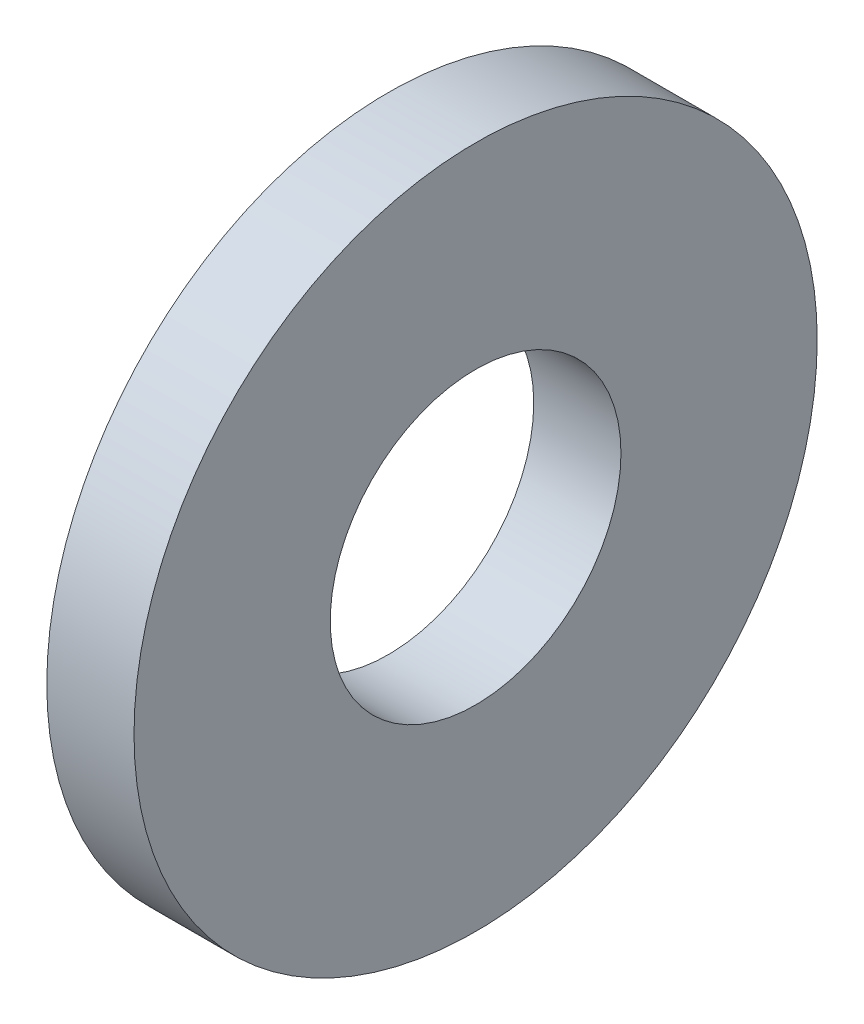
ISO-10303-21;
HEADER;
FILE_DESCRIPTION(('STEP AP214'),'2;1');
FILE_NAME('part.step','',(''),(''),'','','');
FILE_SCHEMA(('AUTOMOTIVE_DESIGN { 1 0 10303 214 1 1 1 1 }'));
ENDSEC;
DATA;
#1=APPLICATION_CONTEXT('core data for automotive mechanical design processes');
#2=APPLICATION_PROTOCOL_DEFINITION('international standard','automotive_design',2000,#1);
#3=PRODUCT_CONTEXT('',#1,'mechanical');
#4=PRODUCT('Part','Part','',(#3));
#5=PRODUCT_RELATED_PRODUCT_CATEGORY('part','',(#4));
#6=PRODUCT_DEFINITION_FORMATION('','',#4);
#7=PRODUCT_DEFINITION_CONTEXT('part definition',#1,'design');
#8=PRODUCT_DEFINITION('design','',#6,#7);
#9=PRODUCT_DEFINITION_SHAPE('','',#8);
#10=(LENGTH_UNIT() NAMED_UNIT(*) SI_UNIT(.MILLI.,.METRE.));
#11=(NAMED_UNIT(*) PLANE_ANGLE_UNIT() SI_UNIT($,.RADIAN.));
#12=(NAMED_UNIT(*) SI_UNIT($,.STERADIAN.) SOLID_ANGLE_UNIT());
#13=UNCERTAINTY_MEASURE_WITH_UNIT(LENGTH_MEASURE(1.E-05),#10,'distance_accuracy_value','');
#14=(GEOMETRIC_REPRESENTATION_CONTEXT(3) GLOBAL_UNCERTAINTY_ASSIGNED_CONTEXT((#13)) GLOBAL_UNIT_ASSIGNED_CONTEXT((#10,
#11,#12)) REPRESENTATION_CONTEXT('',''));
#15=CARTESIAN_POINT('',(0.,0.,0.));
#16=DIRECTION('',(0.,0.,1.));
#17=DIRECTION('',(1.,0.,0.));
#18=AXIS2_PLACEMENT_3D('',#15,#16,#17);
#19=CARTESIAN_POINT('',(3.,0.,0.));
#20=DIRECTION('',(1.,0.,0.));
#21=DIRECTION('',(0.,0.,-1.));
#22=AXIS2_PLACEMENT_3D('',#19,#20,#21);
#23=PLANE('',#22);
#24=CARTESIAN_POINT('',(3.,0.,0.));
#25=DIRECTION('',(1.,0.,0.));
#26=DIRECTION('',(0.,0.,-1.));
#27=AXIS2_PLACEMENT_3D('',#24,#25,#26);
#28=CIRCLE('',#27,11.75);
#29=CARTESIAN_POINT('',(3.,0.,-11.75));
#30=VERTEX_POINT('',#29);
#31=EDGE_CURVE('E10',#30,#30,#28,.T.);
#32=ORIENTED_EDGE('',*,*,#31,.T.);
#33=EDGE_LOOP('',(#32));
#34=FACE_BOUND('',#33,.T.);
#35=CARTESIAN_POINT('',(3.,0.,0.));
#36=DIRECTION('',(1.,0.,0.));
#37=DIRECTION('',(0.,0.,-1.));
#38=AXIS2_PLACEMENT_3D('',#35,#36,#37);
#39=CIRCLE('',#38,5.);
#40=CARTESIAN_POINT('',(3.,0.,-5.));
#41=VERTEX_POINT('',#40);
#42=EDGE_CURVE('E42',#41,#41,#39,.T.);
#43=ORIENTED_EDGE('',*,*,#42,.F.);
#44=EDGE_LOOP('',(#43));
#45=FACE_BOUND('',#44,.T.);
#46=ADVANCED_FACE('F31',(#34,#45),#23,.T.);
#47=CARTESIAN_POINT('',(0.,0.,0.));
#48=DIRECTION('',(1.,0.,0.));
#49=DIRECTION('',(0.,0.,-1.));
#50=AXIS2_PLACEMENT_3D('',#47,#48,#49);
#51=PLANE('',#50);
#52=CARTESIAN_POINT('',(0.,0.,0.));
#53=DIRECTION('',(1.,0.,0.));
#54=DIRECTION('',(0.,0.,-1.));
#55=AXIS2_PLACEMENT_3D('',#52,#53,#54);
#56=CIRCLE('',#55,11.75);
#57=CARTESIAN_POINT('',(0.,0.,-11.75));
#58=VERTEX_POINT('',#57);
#59=EDGE_CURVE('E35',#58,#58,#56,.T.);
#60=ORIENTED_EDGE('',*,*,#59,.F.);
#61=EDGE_LOOP('',(#60));
#62=FACE_BOUND('',#61,.T.);
#63=CARTESIAN_POINT('',(0.,0.,0.));
#64=DIRECTION('',(1.,0.,0.));
#65=DIRECTION('',(0.,0.,-1.));
#66=AXIS2_PLACEMENT_3D('',#63,#64,#65);
#67=CIRCLE('',#66,5.);
#68=CARTESIAN_POINT('',(0.,0.,-5.));
#69=VERTEX_POINT('',#68);
#70=EDGE_CURVE('E44',#69,#69,#67,.T.);
#71=ORIENTED_EDGE('',*,*,#70,.T.);
#72=EDGE_LOOP('',(#71));
#73=FACE_BOUND('',#72,.T.);
#74=ADVANCED_FACE('F54',(#62,#73),#51,.F.);
#75=CARTESIAN_POINT('',(3.,0.,0.));
#76=DIRECTION('',(-1.,0.,0.));
#77=DIRECTION('',(0.,0.,1.));
#78=AXIS2_PLACEMENT_3D('',#75,#76,#77);
#79=CYLINDRICAL_SURFACE('',#78,11.75);
#80=ORIENTED_EDGE('',*,*,#31,.F.);
#81=EDGE_LOOP('',(#80));
#82=FACE_BOUND('',#81,.T.);
#83=ORIENTED_EDGE('',*,*,#59,.T.);
#84=EDGE_LOOP('',(#83));
#85=FACE_BOUND('',#84,.T.);
#86=ADVANCED_FACE('F33',(#82,#85),#79,.T.);
#87=CARTESIAN_POINT('',(3.,0.,0.));
#88=DIRECTION('',(-1.,0.,0.));
#89=DIRECTION('',(0.,0.,1.));
#90=AXIS2_PLACEMENT_3D('',#87,#88,#89);
#91=CYLINDRICAL_SURFACE('',#90,5.);
#92=ORIENTED_EDGE('',*,*,#42,.T.);
#93=EDGE_LOOP('',(#92));
#94=FACE_BOUND('',#93,.T.);
#95=ORIENTED_EDGE('',*,*,#70,.F.);
#96=EDGE_LOOP('',(#95));
#97=FACE_BOUND('',#96,.T.);
#98=ADVANCED_FACE('F50',(#94,#97),#91,.F.);
#99=CLOSED_SHELL('',(#46,#74,#86,#98));
#100=MANIFOLD_SOLID_BREP('B2',#99);
#101=ADVANCED_BREP_SHAPE_REPRESENTATION('',(#18,#100),#14);
#102=SHAPE_DEFINITION_REPRESENTATION(#9,#101);
ENDSEC;
END-ISO-10303-21;
